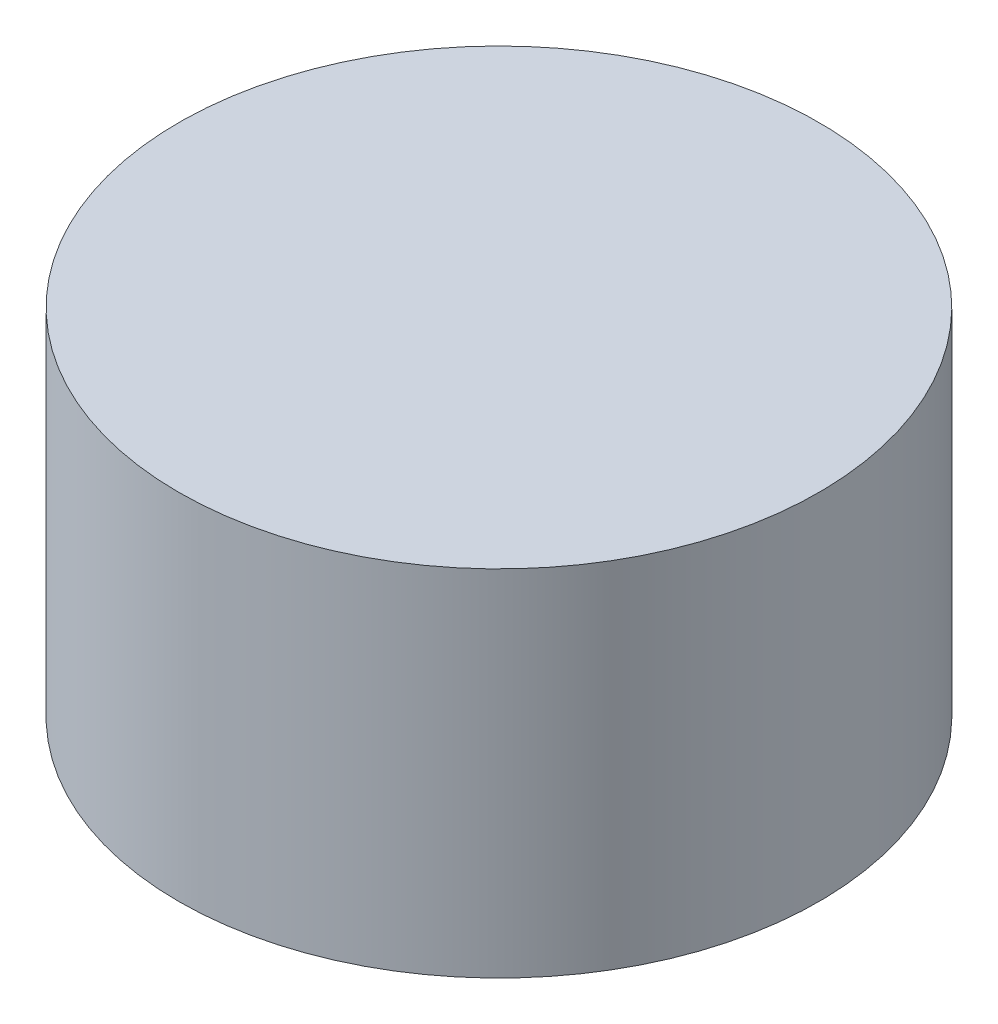
ISO-10303-21;
HEADER;
FILE_DESCRIPTION(('STEP AP214'),'2;1');
FILE_NAME('part.step','',(''),(''),'','','');
FILE_SCHEMA(('AUTOMOTIVE_DESIGN { 1 0 10303 214 1 1 1 1 }'));
ENDSEC;
DATA;
#1=APPLICATION_CONTEXT('core data for automotive mechanical design processes');
#2=APPLICATION_PROTOCOL_DEFINITION('international standard','automotive_design',2000,#1);
#3=PRODUCT_CONTEXT('',#1,'mechanical');
#4=PRODUCT('Part','Part','',(#3));
#5=PRODUCT_RELATED_PRODUCT_CATEGORY('part','',(#4));
#6=PRODUCT_DEFINITION_FORMATION('','',#4);
#7=PRODUCT_DEFINITION_CONTEXT('part definition',#1,'design');
#8=PRODUCT_DEFINITION('design','',#6,#7);
#9=PRODUCT_DEFINITION_SHAPE('','',#8);
#10=(LENGTH_UNIT() NAMED_UNIT(*) SI_UNIT(.MILLI.,.METRE.));
#11=(NAMED_UNIT(*) PLANE_ANGLE_UNIT() SI_UNIT($,.RADIAN.));
#12=(NAMED_UNIT(*) SI_UNIT($,.STERADIAN.) SOLID_ANGLE_UNIT());
#13=UNCERTAINTY_MEASURE_WITH_UNIT(LENGTH_MEASURE(1.E-05),#10,'distance_accuracy_value','');
#14=(GEOMETRIC_REPRESENTATION_CONTEXT(3) GLOBAL_UNCERTAINTY_ASSIGNED_CONTEXT((#13)) GLOBAL_UNIT_ASSIGNED_CONTEXT((#10,
#11,#12)) REPRESENTATION_CONTEXT('',''));
#15=CARTESIAN_POINT('',(0.,0.,0.));
#16=DIRECTION('',(0.,0.,1.));
#17=DIRECTION('',(1.,0.,0.));
#18=AXIS2_PLACEMENT_3D('',#15,#16,#17);
#19=CARTESIAN_POINT('',(0.,12.09,0.));
#20=DIRECTION('',(0.,-1.,0.));
#21=DIRECTION('',(0.,0.,-1.));
#22=AXIS2_PLACEMENT_3D('',#19,#20,#21);
#23=CYLINDRICAL_SURFACE('',#22,10.925);
#24=CARTESIAN_POINT('',(0.,12.09,0.));
#25=DIRECTION('',(0.,1.,0.));
#26=DIRECTION('',(0.,0.,1.));
#27=AXIS2_PLACEMENT_3D('',#24,#25,#26);
#28=CIRCLE('',#27,10.925);
#29=CARTESIAN_POINT('',(0.,12.09,10.925));
#30=VERTEX_POINT('',#29);
#31=EDGE_CURVE('E10',#30,#30,#28,.T.);
#32=ORIENTED_EDGE('',*,*,#31,.F.);
#33=EDGE_LOOP('',(#32));
#34=FACE_BOUND('',#33,.T.);
#35=CARTESIAN_POINT('',(0.,0.,0.));
#36=DIRECTION('',(0.,1.,0.));
#37=DIRECTION('',(0.,0.,1.));
#38=AXIS2_PLACEMENT_3D('',#35,#36,#37);
#39=CIRCLE('',#38,10.925);
#40=CARTESIAN_POINT('',(0.,0.,10.925));
#41=VERTEX_POINT('',#40);
#42=EDGE_CURVE('E40',#41,#41,#39,.T.);
#43=ORIENTED_EDGE('',*,*,#42,.T.);
#44=EDGE_LOOP('',(#43));
#45=FACE_BOUND('',#44,.T.);
#46=ADVANCED_FACE('F37',(#34,#45),#23,.T.);
#47=CARTESIAN_POINT('',(0.,12.09,0.));
#48=DIRECTION('',(0.,1.,0.));
#49=DIRECTION('',(0.,0.,1.));
#50=AXIS2_PLACEMENT_3D('',#47,#48,#49);
#51=PLANE('',#50);
#52=ORIENTED_EDGE('',*,*,#31,.T.);
#53=EDGE_LOOP('',(#52));
#54=FACE_BOUND('',#53,.T.);
#55=ADVANCED_FACE('F54',(#54),#51,.T.);
#56=CARTESIAN_POINT('',(0.,0.,0.));
#57=DIRECTION('',(0.,1.,0.));
#58=DIRECTION('',(0.,0.,1.));
#59=AXIS2_PLACEMENT_3D('',#56,#57,#58);
#60=PLANE('',#59);
#61=ORIENTED_EDGE('',*,*,#42,.F.);
#62=EDGE_LOOP('',(#61));
#63=FACE_BOUND('',#62,.T.);
#64=ADVANCED_FACE('F52',(#63),#60,.F.);
#65=CLOSED_SHELL('',(#46,#55,#64));
#66=MANIFOLD_SOLID_BREP('B2',#65);
#67=ADVANCED_BREP_SHAPE_REPRESENTATION('',(#18,#66),#14);
#68=SHAPE_DEFINITION_REPRESENTATION(#9,#67);
ENDSEC;
END-ISO-10303-21;
